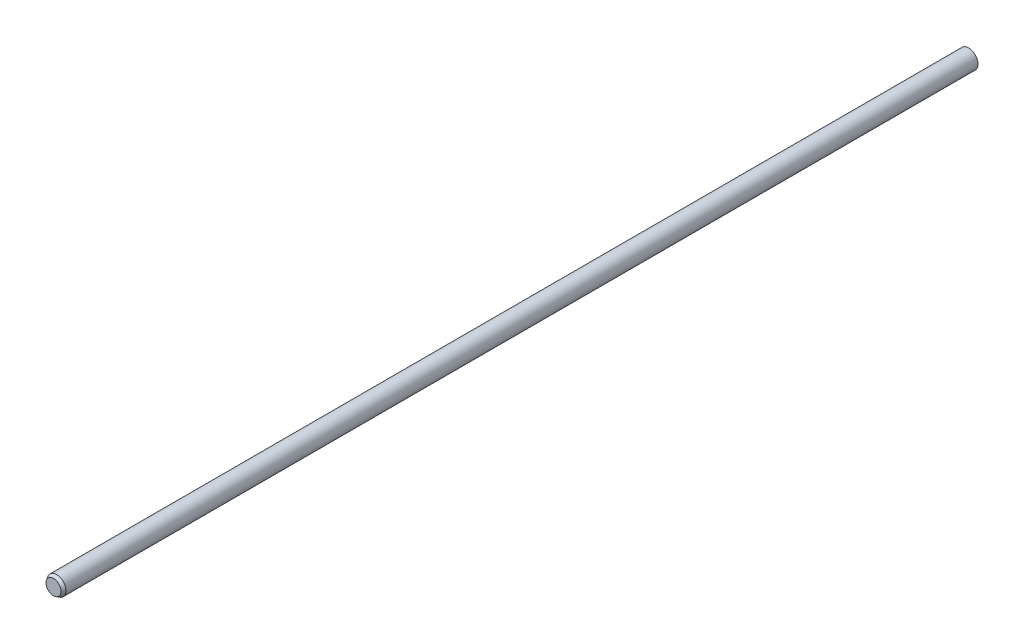
ISO-10303-21;
HEADER;
FILE_DESCRIPTION(('STEP AP214'),'2;1');
FILE_NAME('part.step','',(''),(''),'','','');
FILE_SCHEMA(('AUTOMOTIVE_DESIGN { 1 0 10303 214 1 1 1 1 }'));
ENDSEC;
DATA;
#1=APPLICATION_CONTEXT('core data for automotive mechanical design processes');
#2=APPLICATION_PROTOCOL_DEFINITION('international standard','automotive_design',2000,#1);
#3=PRODUCT_CONTEXT('',#1,'mechanical');
#4=PRODUCT('Part','Part','',(#3));
#5=PRODUCT_RELATED_PRODUCT_CATEGORY('part','',(#4));
#6=PRODUCT_DEFINITION_FORMATION('','',#4);
#7=PRODUCT_DEFINITION_CONTEXT('part definition',#1,'design');
#8=PRODUCT_DEFINITION('design','',#6,#7);
#9=PRODUCT_DEFINITION_SHAPE('','',#8);
#10=(LENGTH_UNIT() NAMED_UNIT(*) SI_UNIT(.MILLI.,.METRE.));
#11=(NAMED_UNIT(*) PLANE_ANGLE_UNIT() SI_UNIT($,.RADIAN.));
#12=(NAMED_UNIT(*) SI_UNIT($,.STERADIAN.) SOLID_ANGLE_UNIT());
#13=UNCERTAINTY_MEASURE_WITH_UNIT(LENGTH_MEASURE(1.E-05),#10,'distance_accuracy_value','');
#14=(GEOMETRIC_REPRESENTATION_CONTEXT(3) GLOBAL_UNCERTAINTY_ASSIGNED_CONTEXT((#13)) GLOBAL_UNIT_ASSIGNED_CONTEXT((#10,
#11,#12)) REPRESENTATION_CONTEXT('',''));
#15=CARTESIAN_POINT('',(0.,0.,0.));
#16=DIRECTION('',(0.,0.,1.));
#17=DIRECTION('',(1.,0.,0.));
#18=AXIS2_PLACEMENT_3D('',#15,#16,#17);
#19=CARTESIAN_POINT('',(0.,0.,295.));
#20=DIRECTION('',(0.,0.,-1.));
#21=DIRECTION('',(-1.,0.,0.));
#22=AXIS2_PLACEMENT_3D('',#19,#20,#21);
#23=CYLINDRICAL_SURFACE('',#22,3.);
#24=CARTESIAN_POINT('',(0.,0.,0.577350269189592));
#25=DIRECTION('',(0.,0.,1.));
#26=DIRECTION('',(1.,0.,0.));
#27=AXIS2_PLACEMENT_3D('',#24,#25,#26);
#28=CIRCLE('',#27,3.);
#29=CARTESIAN_POINT('',(3.,0.,0.577350269189592));
#30=VERTEX_POINT('',#29);
#31=EDGE_CURVE('E48',#30,#30,#28,.T.);
#32=ORIENTED_EDGE('',*,*,#31,.T.);
#33=EDGE_LOOP('',(#32));
#34=FACE_BOUND('',#33,.T.);
#35=CARTESIAN_POINT('',(0.,0.,294.));
#36=DIRECTION('',(0.,0.,1.));
#37=DIRECTION('',(1.,0.,0.));
#38=AXIS2_PLACEMENT_3D('',#35,#36,#37);
#39=CIRCLE('',#38,3.);
#40=CARTESIAN_POINT('',(3.,0.,294.));
#41=VERTEX_POINT('',#40);
#42=EDGE_CURVE('E55',#41,#41,#39,.F.);
#43=ORIENTED_EDGE('',*,*,#42,.T.);
#44=EDGE_LOOP('',(#43));
#45=FACE_BOUND('',#44,.T.);
#46=ADVANCED_FACE('F40',(#34,#45),#23,.T.);
#47=CARTESIAN_POINT('',(0.,0.,295.));
#48=DIRECTION('',(0.,0.,1.));
#49=DIRECTION('',(1.,0.,0.));
#50=AXIS2_PLACEMENT_3D('',#47,#48,#49);
#51=PLANE('',#50);
#52=CARTESIAN_POINT('',(0.,0.,295.));
#53=DIRECTION('',(0.,0.,1.));
#54=DIRECTION('',(1.,0.,0.));
#55=AXIS2_PLACEMENT_3D('',#52,#53,#54);
#56=CIRCLE('',#55,2.42264973081036);
#57=CARTESIAN_POINT('',(2.42264973081036,0.,295.));
#58=VERTEX_POINT('',#57);
#59=EDGE_CURVE('E10',#58,#58,#56,.T.);
#60=ORIENTED_EDGE('',*,*,#59,.T.);
#61=EDGE_LOOP('',(#60));
#62=FACE_BOUND('',#61,.T.);
#63=ADVANCED_FACE('F67',(#62),#51,.T.);
#64=CARTESIAN_POINT('',(0.,0.,0.));
#65=DIRECTION('',(0.,0.,1.));
#66=DIRECTION('',(1.,0.,0.));
#67=AXIS2_PLACEMENT_3D('',#64,#65,#66);
#68=PLANE('',#67);
#69=CARTESIAN_POINT('',(0.,0.,0.));
#70=DIRECTION('',(0.,0.,1.));
#71=DIRECTION('',(1.,0.,0.));
#72=AXIS2_PLACEMENT_3D('',#69,#70,#71);
#73=CIRCLE('',#72,2.);
#74=CARTESIAN_POINT('',(2.,0.,0.));
#75=VERTEX_POINT('',#74);
#76=EDGE_CURVE('E42',#75,#75,#73,.F.);
#77=ORIENTED_EDGE('',*,*,#76,.T.);
#78=EDGE_LOOP('',(#77));
#79=FACE_BOUND('',#78,.T.);
#80=ADVANCED_FACE('F63',(#79),#68,.F.);
#81=CARTESIAN_POINT('',(0.,0.,0.577350269189592));
#82=DIRECTION('',(0.,0.,1.));
#83=DIRECTION('',(1.,0.,0.));
#84=AXIS2_PLACEMENT_3D('',#81,#82,#83);
#85=CONICAL_SURFACE('',#84,3.,1.04719755119662);
#86=ORIENTED_EDGE('',*,*,#76,.F.);
#87=EDGE_LOOP('',(#86));
#88=FACE_BOUND('',#87,.T.);
#89=ORIENTED_EDGE('',*,*,#31,.F.);
#90=EDGE_LOOP('',(#89));
#91=FACE_BOUND('',#90,.T.);
#92=ADVANCED_FACE('F62',(#88,#91),#85,.T.);
#93=CARTESIAN_POINT('',(0.,0.,295.));
#94=DIRECTION('',(0.,0.,-1.));
#95=DIRECTION('',(-1.,0.,0.));
#96=AXIS2_PLACEMENT_3D('',#93,#94,#95);
#97=CONICAL_SURFACE('',#96,2.42264973081036,0.523598775598313);
#98=ORIENTED_EDGE('',*,*,#42,.F.);
#99=EDGE_LOOP('',(#98));
#100=FACE_BOUND('',#99,.T.);
#101=ORIENTED_EDGE('',*,*,#59,.F.);
#102=EDGE_LOOP('',(#101));
#103=FACE_BOUND('',#102,.T.);
#104=ADVANCED_FACE('F39',(#100,#103),#97,.T.);
#105=CLOSED_SHELL('',(#46,#63,#80,#92,#104));
#106=MANIFOLD_SOLID_BREP('B2',#105);
#107=ADVANCED_BREP_SHAPE_REPRESENTATION('',(#18,#106),#14);
#108=SHAPE_DEFINITION_REPRESENTATION(#9,#107);
ENDSEC;
END-ISO-10303-21;
